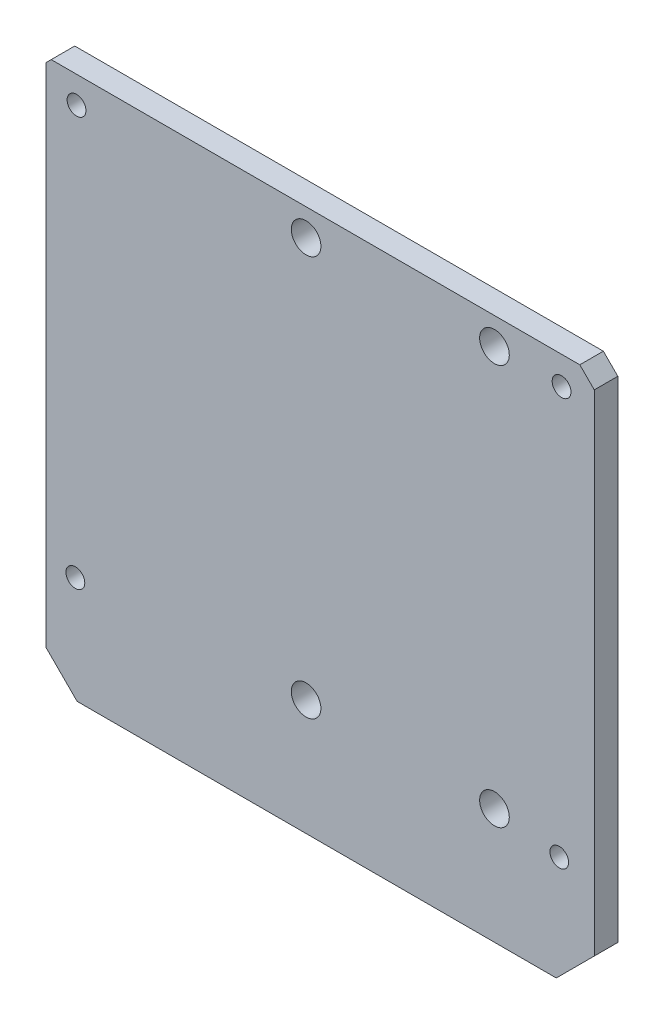
ISO-10303-21;
HEADER;
FILE_DESCRIPTION(('STEP AP214'),'2;1');
FILE_NAME('part.step','',(''),(''),'','','');
FILE_SCHEMA(('AUTOMOTIVE_DESIGN { 1 0 10303 214 1 1 1 1 }'));
ENDSEC;
DATA;
#1=APPLICATION_CONTEXT('core data for automotive mechanical design processes');
#2=APPLICATION_PROTOCOL_DEFINITION('international standard','automotive_design',2000,#1);
#3=PRODUCT_CONTEXT('',#1,'mechanical');
#4=PRODUCT('Part','Part','',(#3));
#5=PRODUCT_RELATED_PRODUCT_CATEGORY('part','',(#4));
#6=PRODUCT_DEFINITION_FORMATION('','',#4);
#7=PRODUCT_DEFINITION_CONTEXT('part definition',#1,'design');
#8=PRODUCT_DEFINITION('design','',#6,#7);
#9=PRODUCT_DEFINITION_SHAPE('','',#8);
#10=(LENGTH_UNIT() NAMED_UNIT(*) SI_UNIT(.MILLI.,.METRE.));
#11=(NAMED_UNIT(*) PLANE_ANGLE_UNIT() SI_UNIT($,.RADIAN.));
#12=(NAMED_UNIT(*) SI_UNIT($,.STERADIAN.) SOLID_ANGLE_UNIT());
#13=UNCERTAINTY_MEASURE_WITH_UNIT(LENGTH_MEASURE(1.E-05),#10,'distance_accuracy_value','');
#14=(GEOMETRIC_REPRESENTATION_CONTEXT(3) GLOBAL_UNCERTAINTY_ASSIGNED_CONTEXT((#13)) GLOBAL_UNIT_ASSIGNED_CONTEXT((#10,
#11,#12)) REPRESENTATION_CONTEXT('',''));
#15=CARTESIAN_POINT('',(0.,0.,0.));
#16=DIRECTION('',(0.,0.,1.));
#17=DIRECTION('',(1.,0.,0.));
#18=AXIS2_PLACEMENT_3D('',#15,#16,#17);
#19=CARTESIAN_POINT('',(3093.90878981986,-2361.94274630067,6.27155172413793));
#20=DIRECTION('',(0.,0.,-1.));
#21=DIRECTION('',(-1.,0.,0.));
#22=AXIS2_PLACEMENT_3D('',#19,#20,#21);
#23=PLANE('',#22);
#24=DIRECTION('',(0.,-1.,0.));
#25=VECTOR('',#24,1.);
#26=CARTESIAN_POINT('',(4119.56786637899,-3193.47436882559,6.27155172413793));
#27=LINE('',#26,#25);
#28=CARTESIAN_POINT('',(4119.56786637899,-3138.73549511364,6.27155172413793));
#29=VERTEX_POINT('',#28);
#30=CARTESIAN_POINT('',(4119.56786637899,-3193.47436882559,6.27155172413793));
#31=VERTEX_POINT('',#30);
#32=EDGE_CURVE('E164',#29,#31,#27,.T.);
#33=ORIENTED_EDGE('',*,*,#32,.T.);
#34=DIRECTION('',(0.707106781186548,-0.707106781186548,0.));
#35=VECTOR('',#34,1.);
#36=CARTESIAN_POINT('',(4122.91165005356,-3196.81815250016,6.27155172413793));
#37=LINE('',#36,#35);
#38=CARTESIAN_POINT('',(4122.91165005356,-3196.81815250016,6.27155172413793));
#39=VERTEX_POINT('',#38);
#40=EDGE_CURVE('E100',#31,#39,#37,.T.);
#41=ORIENTED_EDGE('',*,*,#40,.T.);
#42=DIRECTION('',(1.,0.,0.));
#43=VECTOR('',#42,1.);
#44=CARTESIAN_POINT('',(4174.66455027582,-3196.81815250016,6.27155172413793));
#45=LINE('',#44,#43);
#46=CARTESIAN_POINT('',(4174.66455027582,-3196.81815250016,6.27155172413793));
#47=VERTEX_POINT('',#46);
#48=EDGE_CURVE('E185',#39,#47,#45,.T.);
#49=ORIENTED_EDGE('',*,*,#48,.T.);
#50=DIRECTION('',(0.707106781186548,0.707106781186548,0.));
#51=VECTOR('',#50,1.);
#52=CARTESIAN_POINT('',(4178.77126498487,-3192.71143779111,6.27155172413793));
#53=LINE('',#52,#51);
#54=CARTESIAN_POINT('',(4178.77126498487,-3192.71143779111,6.27155172413793));
#55=VERTEX_POINT('',#54);
#56=EDGE_CURVE('E199',#47,#55,#53,.T.);
#57=ORIENTED_EDGE('',*,*,#56,.T.);
#58=DIRECTION('',(0.,1.,0.));
#59=VECTOR('',#58,1.);
#60=CARTESIAN_POINT('',(4178.77126498487,-3139.75056343093,6.27155172413793));
#61=LINE('',#60,#59);
#62=CARTESIAN_POINT('',(4178.77126498487,-3139.75056343093,6.27155172413793));
#63=VERTEX_POINT('',#62);
#64=EDGE_CURVE('E119',#55,#63,#61,.T.);
#65=ORIENTED_EDGE('',*,*,#64,.T.);
#66=DIRECTION('',(-0.707106781186548,0.707106781186548,0.));
#67=VECTOR('',#66,1.);
#68=CARTESIAN_POINT('',(4177.20765372409,-3138.18695217015,6.27155172413793));
#69=LINE('',#68,#67);
#70=CARTESIAN_POINT('',(4177.20765372409,-3138.18695217015,6.27155172413793));
#71=VERTEX_POINT('',#70);
#72=EDGE_CURVE('E113',#63,#71,#69,.T.);
#73=ORIENTED_EDGE('',*,*,#72,.T.);
#74=DIRECTION('',(-1.,0.,0.));
#75=VECTOR('',#74,1.);
#76=CARTESIAN_POINT('',(4120.11212528592,-3138.18695217015,6.27155172413793));
#77=LINE('',#76,#75);
#78=CARTESIAN_POINT('',(4120.11212528592,-3138.18695217015,6.27155172413793));
#79=VERTEX_POINT('',#78);
#80=EDGE_CURVE('E117',#71,#79,#77,.T.);
#81=ORIENTED_EDGE('',*,*,#80,.T.);
#82=DIRECTION('',(-0.70432934657088,-0.709873348956726,0.));
#83=VECTOR('',#82,1.);
#84=CARTESIAN_POINT('',(4119.56786637899,-3138.73549511364,6.27155172413793));
#85=LINE('',#84,#83);
#86=EDGE_CURVE('E57',#79,#29,#85,.T.);
#87=ORIENTED_EDGE('',*,*,#86,.T.);
#88=EDGE_LOOP('',(#33,#41,#49,#57,#65,#73,#81,#87));
#89=FACE_BOUND('',#88,.T.);
#90=CARTESIAN_POINT('',(4122.84844719444,-3141.08607904974,6.27155172413793));
#91=DIRECTION('',(0.,0.,1.));
#92=DIRECTION('',(1.,0.,0.));
#93=AXIS2_PLACEMENT_3D('',#90,#91,#92);
#94=CIRCLE('',#93,1.01724271543733);
#95=CARTESIAN_POINT('',(4123.86568990987,-3141.08607904974,6.27155172413793));
#96=VERTEX_POINT('',#95);
#97=EDGE_CURVE('E146',#96,#96,#94,.T.);
#98=ORIENTED_EDGE('',*,*,#97,.F.);
#99=EDGE_LOOP('',(#98));
#100=FACE_BOUND('',#99,.T.);
#101=CARTESIAN_POINT('',(4147.64279669793,-3141.09118939221,6.27155172413793));
#102=DIRECTION('',(0.,0.,1.));
#103=DIRECTION('',(1.,0.,0.));
#104=AXIS2_PLACEMENT_3D('',#101,#102,#103);
#105=CIRCLE('',#104,1.6009584377593);
#106=CARTESIAN_POINT('',(4149.24375513569,-3141.09118939221,6.27155172413793));
#107=VERTEX_POINT('',#106);
#108=EDGE_CURVE('E213',#107,#107,#105,.T.);
#109=ORIENTED_EDGE('',*,*,#108,.F.);
#110=EDGE_LOOP('',(#109));
#111=FACE_BOUND('',#110,.T.);
#112=CARTESIAN_POINT('',(4167.98853119917,-3141.08607777752,6.27155172413793));
#113=DIRECTION('',(0.,0.,1.));
#114=DIRECTION('',(1.,0.,0.));
#115=AXIS2_PLACEMENT_3D('',#112,#113,#114);
#116=CIRCLE('',#115,1.60185482818195);
#117=CARTESIAN_POINT('',(4169.59038602736,-3141.08607777752,6.27155172413793));
#118=VERTEX_POINT('',#117);
#119=EDGE_CURVE('E221',#118,#118,#116,.T.);
#120=ORIENTED_EDGE('',*,*,#119,.F.);
#121=EDGE_LOOP('',(#120));
#122=FACE_BOUND('',#121,.T.);
#123=CARTESIAN_POINT('',(4175.23639227076,-3141.21322224924,6.27155172413793));
#124=DIRECTION('',(0.,0.,1.));
#125=DIRECTION('',(1.,0.,0.));
#126=AXIS2_PLACEMENT_3D('',#123,#124,#125);
#127=CIRCLE('',#126,1.0172532086189);
#128=CARTESIAN_POINT('',(4176.25364547938,-3141.21322224924,6.27155172413793));
#129=VERTEX_POINT('',#128);
#130=EDGE_CURVE('E229',#129,#129,#127,.T.);
#131=ORIENTED_EDGE('',*,*,#130,.F.);
#132=EDGE_LOOP('',(#131));
#133=FACE_BOUND('',#132,.T.);
#134=CARTESIAN_POINT('',(4174.98749126391,-3185.34762139238,6.27155172413793));
#135=DIRECTION('',(0.,0.,1.));
#136=DIRECTION('',(1.,0.,0.));
#137=AXIS2_PLACEMENT_3D('',#134,#135,#136);
#138=CIRCLE('',#137,1.00764665448001);
#139=CARTESIAN_POINT('',(4175.99513791839,-3185.34762139238,6.27155172413793));
#140=VERTEX_POINT('',#139);
#141=EDGE_CURVE('E237',#140,#140,#138,.T.);
#142=ORIENTED_EDGE('',*,*,#141,.F.);
#143=EDGE_LOOP('',(#142));
#144=FACE_BOUND('',#143,.T.);
#145=CARTESIAN_POINT('',(4167.98853119917,-3184.31892943561,6.27155172413793));
#146=DIRECTION('',(0.,0.,1.));
#147=DIRECTION('',(1.,0.,0.));
#148=AXIS2_PLACEMENT_3D('',#145,#146,#147);
#149=CIRCLE('',#148,1.60179502683559);
#150=CARTESIAN_POINT('',(4169.59032622601,-3184.31892943561,6.27155172413793));
#151=VERTEX_POINT('',#150);
#152=EDGE_CURVE('E245',#151,#151,#149,.T.);
#153=ORIENTED_EDGE('',*,*,#152,.F.);
#154=EDGE_LOOP('',(#153));
#155=FACE_BOUND('',#154,.T.);
#156=CARTESIAN_POINT('',(4147.64192762826,-3184.3210398125,6.27155172413793));
#157=DIRECTION('',(0.,0.,1.));
#158=DIRECTION('',(1.,0.,0.));
#159=AXIS2_PLACEMENT_3D('',#156,#157,#158);
#160=CIRCLE('',#159,1.59942446321317);
#161=CARTESIAN_POINT('',(4149.24135209148,-3184.3210398125,6.27155172413793));
#162=VERTEX_POINT('',#161);
#163=EDGE_CURVE('E253',#162,#162,#160,.T.);
#164=ORIENTED_EDGE('',*,*,#163,.F.);
#165=EDGE_LOOP('',(#164));
#166=FACE_BOUND('',#165,.T.);
#167=CARTESIAN_POINT('',(4122.72130023488,-3185.33606448152,6.27155172413793));
#168=DIRECTION('',(0.,0.,1.));
#169=DIRECTION('',(1.,0.,0.));
#170=AXIS2_PLACEMENT_3D('',#167,#168,#169);
#171=CIRCLE('',#170,1.01724804649275);
#172=CARTESIAN_POINT('',(4123.73854828137,-3185.33606448152,6.27155172413793));
#173=VERTEX_POINT('',#172);
#174=EDGE_CURVE('E261',#173,#173,#171,.T.);
#175=ORIENTED_EDGE('',*,*,#174,.F.);
#176=EDGE_LOOP('',(#175));
#177=FACE_BOUND('',#176,.T.);
#178=ADVANCED_FACE('F39',(#89,#100,#111,#122,#133,#144,#155,#166,#177),#23,.F.);
#179=CARTESIAN_POINT('',(3093.90878981986,-2361.94274630067,3.72844827586207));
#180=DIRECTION('',(0.,0.,-1.));
#181=DIRECTION('',(-1.,0.,0.));
#182=AXIS2_PLACEMENT_3D('',#179,#180,#181);
#183=PLANE('',#182);
#184=CARTESIAN_POINT('',(4147.64192762826,-3184.3210398125,3.72844827586207));
#185=DIRECTION('',(0.,0.,1.));
#186=DIRECTION('',(1.,0.,0.));
#187=AXIS2_PLACEMENT_3D('',#184,#185,#186);
#188=CIRCLE('',#187,1.59942446321317);
#189=CARTESIAN_POINT('',(4149.24135209148,-3184.3210398125,3.72844827586207));
#190=VERTEX_POINT('',#189);
#191=EDGE_CURVE('E257',#190,#190,#188,.T.);
#192=ORIENTED_EDGE('',*,*,#191,.T.);
#193=EDGE_LOOP('',(#192));
#194=FACE_BOUND('',#193,.T.);
#195=CARTESIAN_POINT('',(4174.98749126391,-3185.34762139238,3.72844827586207));
#196=DIRECTION('',(0.,0.,1.));
#197=DIRECTION('',(1.,0.,0.));
#198=AXIS2_PLACEMENT_3D('',#195,#196,#197);
#199=CIRCLE('',#198,1.00764665448001);
#200=CARTESIAN_POINT('',(4175.99513791839,-3185.34762139238,3.72844827586207));
#201=VERTEX_POINT('',#200);
#202=EDGE_CURVE('E241',#201,#201,#199,.T.);
#203=ORIENTED_EDGE('',*,*,#202,.T.);
#204=EDGE_LOOP('',(#203));
#205=FACE_BOUND('',#204,.T.);
#206=CARTESIAN_POINT('',(4167.98853119917,-3141.08607777752,3.72844827586207));
#207=DIRECTION('',(0.,0.,1.));
#208=DIRECTION('',(1.,0.,0.));
#209=AXIS2_PLACEMENT_3D('',#206,#207,#208);
#210=CIRCLE('',#209,1.60185482818195);
#211=CARTESIAN_POINT('',(4169.59038602736,-3141.08607777752,3.72844827586207));
#212=VERTEX_POINT('',#211);
#213=EDGE_CURVE('E225',#212,#212,#210,.T.);
#214=ORIENTED_EDGE('',*,*,#213,.T.);
#215=EDGE_LOOP('',(#214));
#216=FACE_BOUND('',#215,.T.);
#217=CARTESIAN_POINT('',(4122.84844719444,-3141.08607904974,3.72844827586207));
#218=DIRECTION('',(0.,0.,1.));
#219=DIRECTION('',(1.,0.,0.));
#220=AXIS2_PLACEMENT_3D('',#217,#218,#219);
#221=CIRCLE('',#220,1.01724271543733);
#222=CARTESIAN_POINT('',(4123.86568990987,-3141.08607904974,3.72844827586207));
#223=VERTEX_POINT('',#222);
#224=EDGE_CURVE('E209',#223,#223,#221,.T.);
#225=ORIENTED_EDGE('',*,*,#224,.T.);
#226=EDGE_LOOP('',(#225));
#227=FACE_BOUND('',#226,.T.);
#228=DIRECTION('',(0.,-1.,0.));
#229=VECTOR('',#228,1.);
#230=CARTESIAN_POINT('',(4119.56786637899,-3193.47436882559,3.72844827586207));
#231=LINE('',#230,#229);
#232=CARTESIAN_POINT('',(4119.56786637899,-3138.73549511364,3.72844827586207));
#233=VERTEX_POINT('',#232);
#234=CARTESIAN_POINT('',(4119.56786637899,-3193.47436882559,3.72844827586207));
#235=VERTEX_POINT('',#234);
#236=EDGE_CURVE('E141',#233,#235,#231,.T.);
#237=ORIENTED_EDGE('',*,*,#236,.F.);
#238=DIRECTION('',(-0.70432934657088,-0.709873348956726,0.));
#239=VECTOR('',#238,1.);
#240=CARTESIAN_POINT('',(4119.56786637899,-3138.73549511364,3.72844827586207));
#241=LINE('',#240,#239);
#242=CARTESIAN_POINT('',(4120.11212528592,-3138.18695217015,3.72844827586207));
#243=VERTEX_POINT('',#242);
#244=EDGE_CURVE('E92',#243,#233,#241,.T.);
#245=ORIENTED_EDGE('',*,*,#244,.F.);
#246=DIRECTION('',(-1.,0.,0.));
#247=VECTOR('',#246,1.);
#248=CARTESIAN_POINT('',(4120.11212528592,-3138.18695217015,3.72844827586207));
#249=LINE('',#248,#247);
#250=CARTESIAN_POINT('',(4177.20765372409,-3138.18695217015,3.72844827586207));
#251=VERTEX_POINT('',#250);
#252=EDGE_CURVE('E86',#251,#243,#249,.T.);
#253=ORIENTED_EDGE('',*,*,#252,.F.);
#254=DIRECTION('',(-0.707106781186548,0.707106781186548,0.));
#255=VECTOR('',#254,1.);
#256=CARTESIAN_POINT('',(4177.20765372409,-3138.18695217015,3.72844827586207));
#257=LINE('',#256,#255);
#258=CARTESIAN_POINT('',(4178.77126498487,-3139.75056343093,3.72844827586207));
#259=VERTEX_POINT('',#258);
#260=EDGE_CURVE('E128',#259,#251,#257,.T.);
#261=ORIENTED_EDGE('',*,*,#260,.F.);
#262=DIRECTION('',(0.,1.,0.));
#263=VECTOR('',#262,1.);
#264=CARTESIAN_POINT('',(4178.77126498487,-3139.75056343093,3.72844827586207));
#265=LINE('',#264,#263);
#266=CARTESIAN_POINT('',(4178.77126498487,-3192.71143779111,3.72844827586207));
#267=VERTEX_POINT('',#266);
#268=EDGE_CURVE('E155',#267,#259,#265,.T.);
#269=ORIENTED_EDGE('',*,*,#268,.F.);
#270=DIRECTION('',(0.707106781186548,0.707106781186548,0.));
#271=VECTOR('',#270,1.);
#272=CARTESIAN_POINT('',(4178.77126498487,-3192.71143779111,3.72844827586207));
#273=LINE('',#272,#271);
#274=CARTESIAN_POINT('',(4174.66455027582,-3196.81815250016,3.72844827586207));
#275=VERTEX_POINT('',#274);
#276=EDGE_CURVE('E152',#275,#267,#273,.T.);
#277=ORIENTED_EDGE('',*,*,#276,.F.);
#278=DIRECTION('',(1.,0.,0.));
#279=VECTOR('',#278,1.);
#280=CARTESIAN_POINT('',(4174.66455027582,-3196.81815250016,3.72844827586207));
#281=LINE('',#280,#279);
#282=CARTESIAN_POINT('',(4122.91165005356,-3196.81815250016,3.72844827586207));
#283=VERTEX_POINT('',#282);
#284=EDGE_CURVE('E149',#283,#275,#281,.T.);
#285=ORIENTED_EDGE('',*,*,#284,.F.);
#286=DIRECTION('',(0.707106781186548,-0.707106781186548,0.));
#287=VECTOR('',#286,1.);
#288=CARTESIAN_POINT('',(4122.91165005356,-3196.81815250016,3.72844827586207));
#289=LINE('',#288,#287);
#290=EDGE_CURVE('E145',#235,#283,#289,.T.);
#291=ORIENTED_EDGE('',*,*,#290,.F.);
#292=EDGE_LOOP('',(#237,#245,#253,#261,#269,#277,#285,#291));
#293=FACE_BOUND('',#292,.T.);
#294=CARTESIAN_POINT('',(4147.64279669793,-3141.09118939221,3.72844827586207));
#295=DIRECTION('',(0.,0.,1.));
#296=DIRECTION('',(1.,0.,0.));
#297=AXIS2_PLACEMENT_3D('',#294,#295,#296);
#298=CIRCLE('',#297,1.6009584377593);
#299=CARTESIAN_POINT('',(4149.24375513569,-3141.09118939221,3.72844827586207));
#300=VERTEX_POINT('',#299);
#301=EDGE_CURVE('E217',#300,#300,#298,.T.);
#302=ORIENTED_EDGE('',*,*,#301,.T.);
#303=EDGE_LOOP('',(#302));
#304=FACE_BOUND('',#303,.T.);
#305=CARTESIAN_POINT('',(4175.23639227076,-3141.21322224924,3.72844827586207));
#306=DIRECTION('',(0.,0.,1.));
#307=DIRECTION('',(1.,0.,0.));
#308=AXIS2_PLACEMENT_3D('',#305,#306,#307);
#309=CIRCLE('',#308,1.0172532086189);
#310=CARTESIAN_POINT('',(4176.25364547938,-3141.21322224924,3.72844827586207));
#311=VERTEX_POINT('',#310);
#312=EDGE_CURVE('E233',#311,#311,#309,.T.);
#313=ORIENTED_EDGE('',*,*,#312,.T.);
#314=EDGE_LOOP('',(#313));
#315=FACE_BOUND('',#314,.T.);
#316=CARTESIAN_POINT('',(4167.98853119917,-3184.31892943561,3.72844827586207));
#317=DIRECTION('',(0.,0.,1.));
#318=DIRECTION('',(1.,0.,0.));
#319=AXIS2_PLACEMENT_3D('',#316,#317,#318);
#320=CIRCLE('',#319,1.60179502683559);
#321=CARTESIAN_POINT('',(4169.59032622601,-3184.31892943561,3.72844827586207));
#322=VERTEX_POINT('',#321);
#323=EDGE_CURVE('E249',#322,#322,#320,.T.);
#324=ORIENTED_EDGE('',*,*,#323,.T.);
#325=EDGE_LOOP('',(#324));
#326=FACE_BOUND('',#325,.T.);
#327=CARTESIAN_POINT('',(4122.72130023488,-3185.33606448152,3.72844827586207));
#328=DIRECTION('',(0.,0.,1.));
#329=DIRECTION('',(1.,0.,0.));
#330=AXIS2_PLACEMENT_3D('',#327,#328,#329);
#331=CIRCLE('',#330,1.01724804649275);
#332=CARTESIAN_POINT('',(4123.73854828137,-3185.33606448152,3.72844827586207));
#333=VERTEX_POINT('',#332);
#334=EDGE_CURVE('E265',#333,#333,#331,.T.);
#335=ORIENTED_EDGE('',*,*,#334,.T.);
#336=EDGE_LOOP('',(#335));
#337=FACE_BOUND('',#336,.T.);
#338=ADVANCED_FACE('F189',(#194,#205,#216,#227,#293,#304,#315,#326,#337),#183,.T.);
#339=CARTESIAN_POINT('',(4119.56786637899,-3193.47436882559,6.27155172413793));
#340=DIRECTION('',(1.,0.,0.));
#341=DIRECTION('',(0.,0.,-1.));
#342=AXIS2_PLACEMENT_3D('',#339,#340,#341);
#343=PLANE('',#342);
#344=ORIENTED_EDGE('',*,*,#236,.T.);
#345=DIRECTION('',(0.,0.,-1.));
#346=VECTOR('',#345,1.);
#347=CARTESIAN_POINT('',(4119.56786637899,-3193.47436882559,6.27155172413793));
#348=LINE('',#347,#346);
#349=EDGE_CURVE('E11',#31,#235,#348,.T.);
#350=ORIENTED_EDGE('',*,*,#349,.F.);
#351=ORIENTED_EDGE('',*,*,#32,.F.);
#352=DIRECTION('',(0.,0.,-1.));
#353=VECTOR('',#352,1.);
#354=CARTESIAN_POINT('',(4119.56786637899,-3138.73549511364,6.27155172413793));
#355=LINE('',#354,#353);
#356=EDGE_CURVE('E137',#29,#233,#355,.T.);
#357=ORIENTED_EDGE('',*,*,#356,.T.);
#358=EDGE_LOOP('',(#344,#350,#351,#357));
#359=FACE_BOUND('',#358,.T.);
#360=ADVANCED_FACE('F41',(#359),#343,.F.);
#361=CARTESIAN_POINT('',(4122.91165005356,-3196.81815250016,6.27155172413793));
#362=DIRECTION('',(0.707106781186548,0.707106781186548,0.));
#363=DIRECTION('',(-0.707106781186548,0.707106781186548,0.));
#364=AXIS2_PLACEMENT_3D('',#361,#362,#363);
#365=PLANE('',#364);
#366=ORIENTED_EDGE('',*,*,#290,.T.);
#367=DIRECTION('',(0.,0.,-1.));
#368=VECTOR('',#367,1.);
#369=CARTESIAN_POINT('',(4122.91165005356,-3196.81815250016,6.27155172413793));
#370=LINE('',#369,#368);
#371=EDGE_CURVE('E49',#39,#283,#370,.T.);
#372=ORIENTED_EDGE('',*,*,#371,.F.);
#373=ORIENTED_EDGE('',*,*,#40,.F.);
#374=ORIENTED_EDGE('',*,*,#349,.T.);
#375=EDGE_LOOP('',(#366,#372,#373,#374));
#376=FACE_BOUND('',#375,.T.);
#377=ADVANCED_FACE('F299',(#376),#365,.F.);
#378=CARTESIAN_POINT('',(4174.66455027582,-3196.81815250016,6.27155172413793));
#379=DIRECTION('',(0.,1.,0.));
#380=DIRECTION('',(0.,0.,1.));
#381=AXIS2_PLACEMENT_3D('',#378,#379,#380);
#382=PLANE('',#381);
#383=ORIENTED_EDGE('',*,*,#284,.T.);
#384=DIRECTION('',(0.,0.,-1.));
#385=VECTOR('',#384,1.);
#386=CARTESIAN_POINT('',(4174.66455027582,-3196.81815250016,6.27155172413793));
#387=LINE('',#386,#385);
#388=EDGE_CURVE('E175',#47,#275,#387,.T.);
#389=ORIENTED_EDGE('',*,*,#388,.F.);
#390=ORIENTED_EDGE('',*,*,#48,.F.);
#391=ORIENTED_EDGE('',*,*,#371,.T.);
#392=EDGE_LOOP('',(#383,#389,#390,#391));
#393=FACE_BOUND('',#392,.T.);
#394=ADVANCED_FACE('F183',(#393),#382,.F.);
#395=CARTESIAN_POINT('',(4178.77126498487,-3192.71143779111,6.27155172413793));
#396=DIRECTION('',(-0.707106781186548,0.707106781186548,0.));
#397=DIRECTION('',(-0.707106781186548,-0.707106781186548,0.));
#398=AXIS2_PLACEMENT_3D('',#395,#396,#397);
#399=PLANE('',#398);
#400=ORIENTED_EDGE('',*,*,#276,.T.);
#401=DIRECTION('',(0.,0.,-1.));
#402=VECTOR('',#401,1.);
#403=CARTESIAN_POINT('',(4178.77126498487,-3192.71143779111,6.27155172413793));
#404=LINE('',#403,#402);
#405=EDGE_CURVE('E171',#55,#267,#404,.T.);
#406=ORIENTED_EDGE('',*,*,#405,.F.);
#407=ORIENTED_EDGE('',*,*,#56,.F.);
#408=ORIENTED_EDGE('',*,*,#388,.T.);
#409=EDGE_LOOP('',(#400,#406,#407,#408));
#410=FACE_BOUND('',#409,.T.);
#411=ADVANCED_FACE('F194',(#410),#399,.F.);
#412=CARTESIAN_POINT('',(4178.77126498487,-3139.75056343093,6.27155172413793));
#413=DIRECTION('',(-1.,0.,0.));
#414=DIRECTION('',(0.,0.,1.));
#415=AXIS2_PLACEMENT_3D('',#412,#413,#414);
#416=PLANE('',#415);
#417=ORIENTED_EDGE('',*,*,#268,.T.);
#418=DIRECTION('',(0.,0.,-1.));
#419=VECTOR('',#418,1.);
#420=CARTESIAN_POINT('',(4178.77126498487,-3139.75056343093,6.27155172413793));
#421=LINE('',#420,#419);
#422=EDGE_CURVE('E130',#63,#259,#421,.T.);
#423=ORIENTED_EDGE('',*,*,#422,.F.);
#424=ORIENTED_EDGE('',*,*,#64,.F.);
#425=ORIENTED_EDGE('',*,*,#405,.T.);
#426=EDGE_LOOP('',(#417,#423,#424,#425));
#427=FACE_BOUND('',#426,.T.);
#428=ADVANCED_FACE('F197',(#427),#416,.F.);
#429=CARTESIAN_POINT('',(4177.20765372409,-3138.18695217015,6.27155172413793));
#430=DIRECTION('',(-0.707106781186548,-0.707106781186548,0.));
#431=DIRECTION('',(0.707106781186548,-0.707106781186548,0.));
#432=AXIS2_PLACEMENT_3D('',#429,#430,#431);
#433=PLANE('',#432);
#434=ORIENTED_EDGE('',*,*,#260,.T.);
#435=DIRECTION('',(0.,0.,-1.));
#436=VECTOR('',#435,1.);
#437=CARTESIAN_POINT('',(4177.20765372409,-3138.18695217015,6.27155172413793));
#438=LINE('',#437,#436);
#439=EDGE_CURVE('E125',#71,#251,#438,.T.);
#440=ORIENTED_EDGE('',*,*,#439,.F.);
#441=ORIENTED_EDGE('',*,*,#72,.F.);
#442=ORIENTED_EDGE('',*,*,#422,.T.);
#443=EDGE_LOOP('',(#434,#440,#441,#442));
#444=FACE_BOUND('',#443,.T.);
#445=ADVANCED_FACE('F126',(#444),#433,.F.);
#446=CARTESIAN_POINT('',(4120.11212528592,-3138.18695217015,6.27155172413793));
#447=DIRECTION('',(0.,-1.,0.));
#448=DIRECTION('',(0.,0.,-1.));
#449=AXIS2_PLACEMENT_3D('',#446,#447,#448);
#450=PLANE('',#449);
#451=ORIENTED_EDGE('',*,*,#252,.T.);
#452=DIRECTION('',(0.,0.,-1.));
#453=VECTOR('',#452,1.);
#454=CARTESIAN_POINT('',(4120.11212528592,-3138.18695217015,6.27155172413793));
#455=LINE('',#454,#453);
#456=EDGE_CURVE('E131',#79,#243,#455,.T.);
#457=ORIENTED_EDGE('',*,*,#456,.F.);
#458=ORIENTED_EDGE('',*,*,#80,.F.);
#459=ORIENTED_EDGE('',*,*,#439,.T.);
#460=EDGE_LOOP('',(#451,#457,#458,#459));
#461=FACE_BOUND('',#460,.T.);
#462=ADVANCED_FACE('F133',(#461),#450,.F.);
#463=CARTESIAN_POINT('',(4119.56786637899,-3138.73549511364,6.27155172413793));
#464=DIRECTION('',(0.709873348956726,-0.70432934657088,0.));
#465=DIRECTION('',(0.70432934657088,0.709873348956726,0.));
#466=AXIS2_PLACEMENT_3D('',#463,#464,#465);
#467=PLANE('',#466);
#468=ORIENTED_EDGE('',*,*,#244,.T.);
#469=ORIENTED_EDGE('',*,*,#356,.F.);
#470=ORIENTED_EDGE('',*,*,#86,.F.);
#471=ORIENTED_EDGE('',*,*,#456,.T.);
#472=EDGE_LOOP('',(#468,#469,#470,#471));
#473=FACE_BOUND('',#472,.T.);
#474=ADVANCED_FACE('F287',(#473),#467,.F.);
#475=CARTESIAN_POINT('',(4122.84844719444,-3141.08607904974,6.27155172413793));
#476=DIRECTION('',(0.,0.,-1.));
#477=DIRECTION('',(-1.,0.,0.));
#478=AXIS2_PLACEMENT_3D('',#475,#476,#477);
#479=CYLINDRICAL_SURFACE('',#478,1.01724271543733);
#480=ORIENTED_EDGE('',*,*,#97,.T.);
#481=EDGE_LOOP('',(#480));
#482=FACE_BOUND('',#481,.T.);
#483=ORIENTED_EDGE('',*,*,#224,.F.);
#484=EDGE_LOOP('',(#483));
#485=FACE_BOUND('',#484,.T.);
#486=ADVANCED_FACE('F284',(#482,#485),#479,.F.);
#487=CARTESIAN_POINT('',(4147.64279669793,-3141.09118939221,6.27155172413793));
#488=DIRECTION('',(0.,0.,-1.));
#489=DIRECTION('',(-1.,0.,0.));
#490=AXIS2_PLACEMENT_3D('',#487,#488,#489);
#491=CYLINDRICAL_SURFACE('',#490,1.6009584377593);
#492=ORIENTED_EDGE('',*,*,#108,.T.);
#493=EDGE_LOOP('',(#492));
#494=FACE_BOUND('',#493,.T.);
#495=ORIENTED_EDGE('',*,*,#301,.F.);
#496=EDGE_LOOP('',(#495));
#497=FACE_BOUND('',#496,.T.);
#498=ADVANCED_FACE('F363',(#494,#497),#491,.F.);
#499=CARTESIAN_POINT('',(4167.98853119917,-3141.08607777752,6.27155172413793));
#500=DIRECTION('',(0.,0.,-1.));
#501=DIRECTION('',(-1.,0.,0.));
#502=AXIS2_PLACEMENT_3D('',#499,#500,#501);
#503=CYLINDRICAL_SURFACE('',#502,1.60185482818195);
#504=ORIENTED_EDGE('',*,*,#119,.T.);
#505=EDGE_LOOP('',(#504));
#506=FACE_BOUND('',#505,.T.);
#507=ORIENTED_EDGE('',*,*,#213,.F.);
#508=EDGE_LOOP('',(#507));
#509=FACE_BOUND('',#508,.T.);
#510=ADVANCED_FACE('F371',(#506,#509),#503,.F.);
#511=CARTESIAN_POINT('',(4175.23639227076,-3141.21322224924,6.27155172413793));
#512=DIRECTION('',(0.,0.,-1.));
#513=DIRECTION('',(-1.,0.,0.));
#514=AXIS2_PLACEMENT_3D('',#511,#512,#513);
#515=CYLINDRICAL_SURFACE('',#514,1.0172532086189);
#516=ORIENTED_EDGE('',*,*,#130,.T.);
#517=EDGE_LOOP('',(#516));
#518=FACE_BOUND('',#517,.T.);
#519=ORIENTED_EDGE('',*,*,#312,.F.);
#520=EDGE_LOOP('',(#519));
#521=FACE_BOUND('',#520,.T.);
#522=ADVANCED_FACE('F379',(#518,#521),#515,.F.);
#523=CARTESIAN_POINT('',(4174.98749126391,-3185.34762139238,6.27155172413793));
#524=DIRECTION('',(0.,0.,-1.));
#525=DIRECTION('',(-1.,0.,0.));
#526=AXIS2_PLACEMENT_3D('',#523,#524,#525);
#527=CYLINDRICAL_SURFACE('',#526,1.00764665448001);
#528=ORIENTED_EDGE('',*,*,#141,.T.);
#529=EDGE_LOOP('',(#528));
#530=FACE_BOUND('',#529,.T.);
#531=ORIENTED_EDGE('',*,*,#202,.F.);
#532=EDGE_LOOP('',(#531));
#533=FACE_BOUND('',#532,.T.);
#534=ADVANCED_FACE('F388',(#530,#533),#527,.F.);
#535=CARTESIAN_POINT('',(4167.98853119917,-3184.31892943561,6.27155172413793));
#536=DIRECTION('',(0.,0.,-1.));
#537=DIRECTION('',(-1.,0.,0.));
#538=AXIS2_PLACEMENT_3D('',#535,#536,#537);
#539=CYLINDRICAL_SURFACE('',#538,1.60179502683559);
#540=ORIENTED_EDGE('',*,*,#152,.T.);
#541=EDGE_LOOP('',(#540));
#542=FACE_BOUND('',#541,.T.);
#543=ORIENTED_EDGE('',*,*,#323,.F.);
#544=EDGE_LOOP('',(#543));
#545=FACE_BOUND('',#544,.T.);
#546=ADVANCED_FACE('F397',(#542,#545),#539,.F.);
#547=CARTESIAN_POINT('',(4147.64192762826,-3184.3210398125,6.27155172413793));
#548=DIRECTION('',(0.,0.,-1.));
#549=DIRECTION('',(-1.,0.,0.));
#550=AXIS2_PLACEMENT_3D('',#547,#548,#549);
#551=CYLINDRICAL_SURFACE('',#550,1.59942446321317);
#552=ORIENTED_EDGE('',*,*,#163,.T.);
#553=EDGE_LOOP('',(#552));
#554=FACE_BOUND('',#553,.T.);
#555=ORIENTED_EDGE('',*,*,#191,.F.);
#556=EDGE_LOOP('',(#555));
#557=FACE_BOUND('',#556,.T.);
#558=ADVANCED_FACE('F406',(#554,#557),#551,.F.);
#559=CARTESIAN_POINT('',(4122.72130023488,-3185.33606448152,6.27155172413793));
#560=DIRECTION('',(0.,0.,-1.));
#561=DIRECTION('',(-1.,0.,0.));
#562=AXIS2_PLACEMENT_3D('',#559,#560,#561);
#563=CYLINDRICAL_SURFACE('',#562,1.01724804649275);
#564=ORIENTED_EDGE('',*,*,#174,.T.);
#565=EDGE_LOOP('',(#564));
#566=FACE_BOUND('',#565,.T.);
#567=ORIENTED_EDGE('',*,*,#334,.F.);
#568=EDGE_LOOP('',(#567));
#569=FACE_BOUND('',#568,.T.);
#570=ADVANCED_FACE('F273',(#566,#569),#563,.F.);
#571=CLOSED_SHELL('',(#178,#338,#360,#377,#394,#411,#428,#445,#462,#474,#486,#498,#510,#522,
#534,#546,#558,#570));
#572=MANIFOLD_SOLID_BREP('B2',#571);
#573=ADVANCED_BREP_SHAPE_REPRESENTATION('',(#18,#572),#14);
#574=SHAPE_DEFINITION_REPRESENTATION(#9,#573);
ENDSEC;
END-ISO-10303-21;
